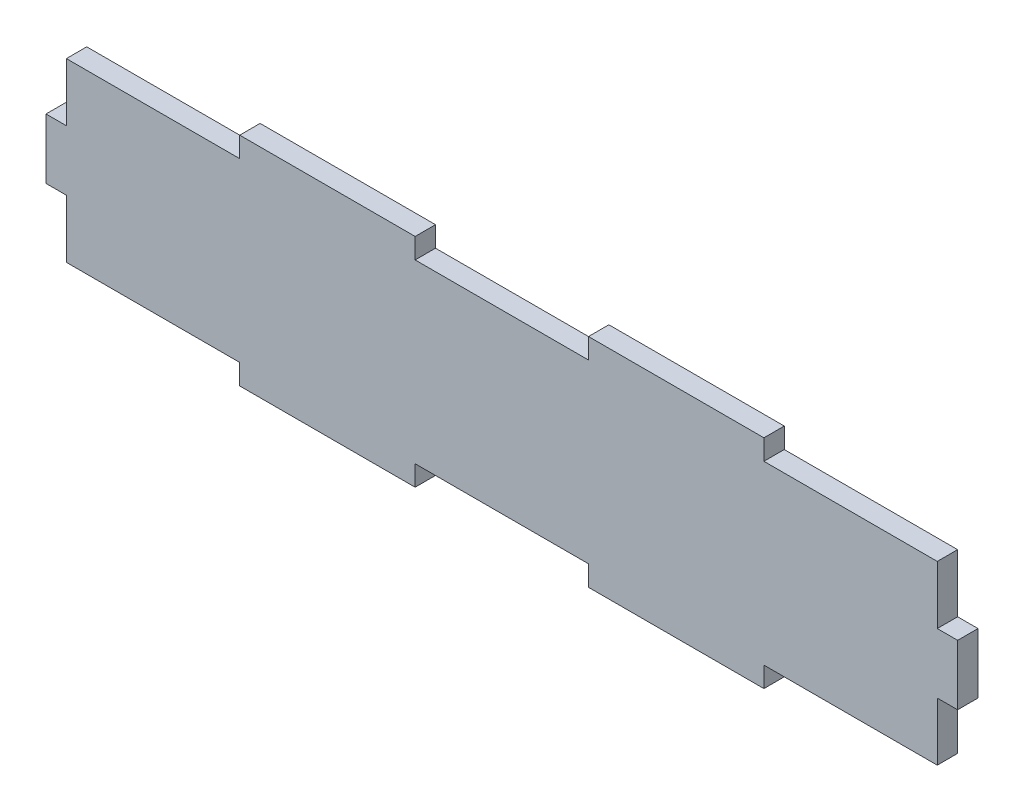
ISO-10303-21;
HEADER;
FILE_DESCRIPTION(('STEP AP214'),'2;1');
FILE_NAME('part.step','',(''),(''),'','','');
FILE_SCHEMA(('AUTOMOTIVE_DESIGN { 1 0 10303 214 1 1 1 1 }'));
ENDSEC;
DATA;
#1=APPLICATION_CONTEXT('core data for automotive mechanical design processes');
#2=APPLICATION_PROTOCOL_DEFINITION('international standard','automotive_design',2000,#1);
#3=PRODUCT_CONTEXT('',#1,'mechanical');
#4=PRODUCT('Part','Part','',(#3));
#5=PRODUCT_RELATED_PRODUCT_CATEGORY('part','',(#4));
#6=PRODUCT_DEFINITION_FORMATION('','',#4);
#7=PRODUCT_DEFINITION_CONTEXT('part definition',#1,'design');
#8=PRODUCT_DEFINITION('design','',#6,#7);
#9=PRODUCT_DEFINITION_SHAPE('','',#8);
#10=(LENGTH_UNIT() NAMED_UNIT(*) SI_UNIT(.MILLI.,.METRE.));
#11=(NAMED_UNIT(*) PLANE_ANGLE_UNIT() SI_UNIT($,.RADIAN.));
#12=(NAMED_UNIT(*) SI_UNIT($,.STERADIAN.) SOLID_ANGLE_UNIT());
#13=UNCERTAINTY_MEASURE_WITH_UNIT(LENGTH_MEASURE(1.E-05),#10,'distance_accuracy_value','');
#14=(GEOMETRIC_REPRESENTATION_CONTEXT(3) GLOBAL_UNCERTAINTY_ASSIGNED_CONTEXT((#13)) GLOBAL_UNIT_ASSIGNED_CONTEXT((#10,
#11,#12)) REPRESENTATION_CONTEXT('',''));
#15=CARTESIAN_POINT('',(0.,0.,0.));
#16=DIRECTION('',(0.,0.,1.));
#17=DIRECTION('',(1.,0.,0.));
#18=AXIS2_PLACEMENT_3D('',#15,#16,#17);
#19=CARTESIAN_POINT('',(-64.15,-4.43333333333333,3.));
#20=DIRECTION('',(1.,0.,0.));
#21=DIRECTION('',(0.,0.,-1.));
#22=AXIS2_PLACEMENT_3D('',#19,#20,#21);
#23=PLANE('',#22);
#24=DIRECTION('',(0.,-1.,0.));
#25=VECTOR('',#24,1.);
#26=CARTESIAN_POINT('',(-64.15,-4.43333333333333,0.));
#27=LINE('',#26,#25);
#28=CARTESIAN_POINT('',(-64.15,-4.43333333333333,0.));
#29=VERTEX_POINT('',#28);
#30=CARTESIAN_POINT('',(-64.15,-13.,0.));
#31=VERTEX_POINT('',#30);
#32=EDGE_CURVE('E260',#29,#31,#27,.T.);
#33=ORIENTED_EDGE('',*,*,#32,.T.);
#34=DIRECTION('',(0.,0.,-1.));
#35=VECTOR('',#34,1.);
#36=CARTESIAN_POINT('',(-64.15,-13.,3.));
#37=LINE('',#36,#35);
#38=CARTESIAN_POINT('',(-64.15,-13.,3.));
#39=VERTEX_POINT('',#38);
#40=EDGE_CURVE('E11',#39,#31,#37,.T.);
#41=ORIENTED_EDGE('',*,*,#40,.F.);
#42=DIRECTION('',(0.,-1.,0.));
#43=VECTOR('',#42,1.);
#44=CARTESIAN_POINT('',(-64.15,-4.43333333333333,3.));
#45=LINE('',#44,#43);
#46=CARTESIAN_POINT('',(-64.15,-4.43333333333333,3.));
#47=VERTEX_POINT('',#46);
#48=EDGE_CURVE('E342',#47,#39,#45,.T.);
#49=ORIENTED_EDGE('',*,*,#48,.F.);
#50=DIRECTION('',(0.,0.,-1.));
#51=VECTOR('',#50,1.);
#52=CARTESIAN_POINT('',(-64.15,-4.43333333333333,3.));
#53=LINE('',#52,#51);
#54=EDGE_CURVE('E256',#47,#29,#53,.T.);
#55=ORIENTED_EDGE('',*,*,#54,.T.);
#56=EDGE_LOOP('',(#33,#41,#49,#55));
#57=FACE_BOUND('',#56,.T.);
#58=ADVANCED_FACE('F39',(#57),#23,.F.);
#59=CARTESIAN_POINT('',(-64.15,-13.,3.));
#60=DIRECTION('',(0.,1.,0.));
#61=DIRECTION('',(0.,0.,1.));
#62=AXIS2_PLACEMENT_3D('',#59,#60,#61);
#63=PLANE('',#62);
#64=DIRECTION('',(1.,0.,0.));
#65=VECTOR('',#64,1.);
#66=CARTESIAN_POINT('',(-64.15,-13.,0.));
#67=LINE('',#66,#65);
#68=CARTESIAN_POINT('',(-38.61,-13.,0.));
#69=VERTEX_POINT('',#68);
#70=EDGE_CURVE('E264',#31,#69,#67,.T.);
#71=ORIENTED_EDGE('',*,*,#70,.T.);
#72=DIRECTION('',(0.,0.,-1.));
#73=VECTOR('',#72,1.);
#74=CARTESIAN_POINT('',(-38.61,-13.,3.));
#75=LINE('',#74,#73);
#76=CARTESIAN_POINT('',(-38.61,-13.,3.));
#77=VERTEX_POINT('',#76);
#78=EDGE_CURVE('E48',#77,#69,#75,.T.);
#79=ORIENTED_EDGE('',*,*,#78,.F.);
#80=DIRECTION('',(1.,0.,0.));
#81=VECTOR('',#80,1.);
#82=CARTESIAN_POINT('',(-64.15,-13.,3.));
#83=LINE('',#82,#81);
#84=EDGE_CURVE('E159',#39,#77,#83,.T.);
#85=ORIENTED_EDGE('',*,*,#84,.F.);
#86=ORIENTED_EDGE('',*,*,#40,.T.);
#87=EDGE_LOOP('',(#71,#79,#85,#86));
#88=FACE_BOUND('',#87,.T.);
#89=ADVANCED_FACE('F548',(#88),#63,.F.);
#90=CARTESIAN_POINT('',(-38.61,-13.,3.));
#91=DIRECTION('',(1.,0.,0.));
#92=DIRECTION('',(0.,0.,-1.));
#93=AXIS2_PLACEMENT_3D('',#90,#91,#92);
#94=PLANE('',#93);
#95=DIRECTION('',(0.,-1.,0.));
#96=VECTOR('',#95,1.);
#97=CARTESIAN_POINT('',(-38.61,-13.,0.));
#98=LINE('',#97,#96);
#99=CARTESIAN_POINT('',(-38.61,-16.,0.));
#100=VERTEX_POINT('',#99);
#101=EDGE_CURVE('E267',#69,#100,#98,.T.);
#102=ORIENTED_EDGE('',*,*,#101,.T.);
#103=DIRECTION('',(0.,0.,-1.));
#104=VECTOR('',#103,1.);
#105=CARTESIAN_POINT('',(-38.61,-16.,3.));
#106=LINE('',#105,#104);
#107=CARTESIAN_POINT('',(-38.61,-16.,3.));
#108=VERTEX_POINT('',#107);
#109=EDGE_CURVE('E433',#108,#100,#106,.T.);
#110=ORIENTED_EDGE('',*,*,#109,.F.);
#111=DIRECTION('',(0.,-1.,0.));
#112=VECTOR('',#111,1.);
#113=CARTESIAN_POINT('',(-38.61,-13.,3.));
#114=LINE('',#113,#112);
#115=EDGE_CURVE('E443',#77,#108,#114,.T.);
#116=ORIENTED_EDGE('',*,*,#115,.F.);
#117=ORIENTED_EDGE('',*,*,#78,.T.);
#118=EDGE_LOOP('',(#102,#110,#116,#117));
#119=FACE_BOUND('',#118,.T.);
#120=ADVANCED_FACE('F441',(#119),#94,.F.);
#121=CARTESIAN_POINT('',(-38.61,-16.,3.));
#122=DIRECTION('',(0.,1.,0.));
#123=DIRECTION('',(0.,0.,1.));
#124=AXIS2_PLACEMENT_3D('',#121,#122,#123);
#125=PLANE('',#124);
#126=DIRECTION('',(1.,0.,0.));
#127=VECTOR('',#126,1.);
#128=CARTESIAN_POINT('',(-38.61,-16.,0.));
#129=LINE('',#128,#127);
#130=CARTESIAN_POINT('',(-12.77,-16.,0.));
#131=VERTEX_POINT('',#130);
#132=EDGE_CURVE('E270',#100,#131,#129,.T.);
#133=ORIENTED_EDGE('',*,*,#132,.T.);
#134=DIRECTION('',(0.,0.,-1.));
#135=VECTOR('',#134,1.);
#136=CARTESIAN_POINT('',(-12.77,-16.,3.));
#137=LINE('',#136,#135);
#138=CARTESIAN_POINT('',(-12.77,-16.,3.));
#139=VERTEX_POINT('',#138);
#140=EDGE_CURVE('E429',#139,#131,#137,.T.);
#141=ORIENTED_EDGE('',*,*,#140,.F.);
#142=DIRECTION('',(1.,0.,0.));
#143=VECTOR('',#142,1.);
#144=CARTESIAN_POINT('',(-38.61,-16.,3.));
#145=LINE('',#144,#143);
#146=EDGE_CURVE('E462',#108,#139,#145,.T.);
#147=ORIENTED_EDGE('',*,*,#146,.F.);
#148=ORIENTED_EDGE('',*,*,#109,.T.);
#149=EDGE_LOOP('',(#133,#141,#147,#148));
#150=FACE_BOUND('',#149,.T.);
#151=ADVANCED_FACE('F452',(#150),#125,.F.);
#152=CARTESIAN_POINT('',(-12.77,-16.,3.));
#153=DIRECTION('',(-1.,0.,0.));
#154=DIRECTION('',(0.,-1.,0.));
#155=AXIS2_PLACEMENT_3D('',#152,#153,#154);
#156=PLANE('',#155);
#157=DIRECTION('',(0.,1.,0.));
#158=VECTOR('',#157,1.);
#159=CARTESIAN_POINT('',(-12.77,-16.,0.));
#160=LINE('',#159,#158);
#161=CARTESIAN_POINT('',(-12.77,-13.,0.));
#162=VERTEX_POINT('',#161);
#163=EDGE_CURVE('E273',#131,#162,#160,.T.);
#164=ORIENTED_EDGE('',*,*,#163,.T.);
#165=DIRECTION('',(0.,0.,-1.));
#166=VECTOR('',#165,1.);
#167=CARTESIAN_POINT('',(-12.77,-13.,3.));
#168=LINE('',#167,#166);
#169=CARTESIAN_POINT('',(-12.77,-13.,3.));
#170=VERTEX_POINT('',#169);
#171=EDGE_CURVE('E425',#170,#162,#168,.T.);
#172=ORIENTED_EDGE('',*,*,#171,.F.);
#173=DIRECTION('',(0.,1.,0.));
#174=VECTOR('',#173,1.);
#175=CARTESIAN_POINT('',(-12.77,-16.,3.));
#176=LINE('',#175,#174);
#177=EDGE_CURVE('E458',#139,#170,#176,.T.);
#178=ORIENTED_EDGE('',*,*,#177,.F.);
#179=ORIENTED_EDGE('',*,*,#140,.T.);
#180=EDGE_LOOP('',(#164,#172,#178,#179));
#181=FACE_BOUND('',#180,.T.);
#182=ADVANCED_FACE('F456',(#181),#156,.F.);
#183=CARTESIAN_POINT('',(-12.77,-13.,3.));
#184=DIRECTION('',(0.,1.,0.));
#185=DIRECTION('',(-1.,0.,0.));
#186=AXIS2_PLACEMENT_3D('',#183,#184,#185);
#187=PLANE('',#186);
#188=DIRECTION('',(1.,0.,0.));
#189=VECTOR('',#188,1.);
#190=CARTESIAN_POINT('',(-12.77,-13.,0.));
#191=LINE('',#190,#189);
#192=CARTESIAN_POINT('',(12.77,-13.,0.));
#193=VERTEX_POINT('',#192);
#194=EDGE_CURVE('E276',#162,#193,#191,.T.);
#195=ORIENTED_EDGE('',*,*,#194,.T.);
#196=DIRECTION('',(0.,0.,-1.));
#197=VECTOR('',#196,1.);
#198=CARTESIAN_POINT('',(12.77,-13.,3.));
#199=LINE('',#198,#197);
#200=CARTESIAN_POINT('',(12.77,-13.,3.));
#201=VERTEX_POINT('',#200);
#202=EDGE_CURVE('E421',#201,#193,#199,.T.);
#203=ORIENTED_EDGE('',*,*,#202,.F.);
#204=DIRECTION('',(1.,0.,0.));
#205=VECTOR('',#204,1.);
#206=CARTESIAN_POINT('',(-12.77,-13.,3.));
#207=LINE('',#206,#205);
#208=EDGE_CURVE('E461',#170,#201,#207,.T.);
#209=ORIENTED_EDGE('',*,*,#208,.F.);
#210=ORIENTED_EDGE('',*,*,#171,.T.);
#211=EDGE_LOOP('',(#195,#203,#209,#210));
#212=FACE_BOUND('',#211,.T.);
#213=ADVANCED_FACE('F561',(#212),#187,.F.);
#214=CARTESIAN_POINT('',(12.77,-13.,3.));
#215=DIRECTION('',(1.,0.,0.));
#216=DIRECTION('',(0.,1.,0.));
#217=AXIS2_PLACEMENT_3D('',#214,#215,#216);
#218=PLANE('',#217);
#219=DIRECTION('',(0.,-1.,0.));
#220=VECTOR('',#219,1.);
#221=CARTESIAN_POINT('',(12.77,-13.,0.));
#222=LINE('',#221,#220);
#223=CARTESIAN_POINT('',(12.77,-16.,0.));
#224=VERTEX_POINT('',#223);
#225=EDGE_CURVE('E279',#193,#224,#222,.T.);
#226=ORIENTED_EDGE('',*,*,#225,.T.);
#227=DIRECTION('',(0.,0.,-1.));
#228=VECTOR('',#227,1.);
#229=CARTESIAN_POINT('',(12.77,-16.,3.));
#230=LINE('',#229,#228);
#231=CARTESIAN_POINT('',(12.77,-16.,3.));
#232=VERTEX_POINT('',#231);
#233=EDGE_CURVE('E417',#232,#224,#230,.T.);
#234=ORIENTED_EDGE('',*,*,#233,.F.);
#235=DIRECTION('',(0.,-1.,0.));
#236=VECTOR('',#235,1.);
#237=CARTESIAN_POINT('',(12.77,-13.,3.));
#238=LINE('',#237,#236);
#239=EDGE_CURVE('E466',#201,#232,#238,.T.);
#240=ORIENTED_EDGE('',*,*,#239,.F.);
#241=ORIENTED_EDGE('',*,*,#202,.T.);
#242=EDGE_LOOP('',(#226,#234,#240,#241));
#243=FACE_BOUND('',#242,.T.);
#244=ADVANCED_FACE('F564',(#243),#218,.F.);
#245=CARTESIAN_POINT('',(12.77,-16.,3.));
#246=DIRECTION('',(0.,1.,0.));
#247=DIRECTION('',(0.,0.,1.));
#248=AXIS2_PLACEMENT_3D('',#245,#246,#247);
#249=PLANE('',#248);
#250=DIRECTION('',(1.,0.,0.));
#251=VECTOR('',#250,1.);
#252=CARTESIAN_POINT('',(12.77,-16.,0.));
#253=LINE('',#252,#251);
#254=CARTESIAN_POINT('',(38.61,-16.,0.));
#255=VERTEX_POINT('',#254);
#256=EDGE_CURVE('E282',#224,#255,#253,.T.);
#257=ORIENTED_EDGE('',*,*,#256,.T.);
#258=DIRECTION('',(0.,0.,-1.));
#259=VECTOR('',#258,1.);
#260=CARTESIAN_POINT('',(38.61,-16.,3.));
#261=LINE('',#260,#259);
#262=CARTESIAN_POINT('',(38.61,-16.,3.));
#263=VERTEX_POINT('',#262);
#264=EDGE_CURVE('E413',#263,#255,#261,.T.);
#265=ORIENTED_EDGE('',*,*,#264,.F.);
#266=DIRECTION('',(1.,0.,0.));
#267=VECTOR('',#266,1.);
#268=CARTESIAN_POINT('',(12.77,-16.,3.));
#269=LINE('',#268,#267);
#270=EDGE_CURVE('E473',#232,#263,#269,.T.);
#271=ORIENTED_EDGE('',*,*,#270,.F.);
#272=ORIENTED_EDGE('',*,*,#233,.T.);
#273=EDGE_LOOP('',(#257,#265,#271,#272));
#274=FACE_BOUND('',#273,.T.);
#275=ADVANCED_FACE('F568',(#274),#249,.F.);
#276=CARTESIAN_POINT('',(38.61,-16.,3.));
#277=DIRECTION('',(-1.,0.,0.));
#278=DIRECTION('',(0.,0.,1.));
#279=AXIS2_PLACEMENT_3D('',#276,#277,#278);
#280=PLANE('',#279);
#281=DIRECTION('',(0.,1.,0.));
#282=VECTOR('',#281,1.);
#283=CARTESIAN_POINT('',(38.61,-16.,0.));
#284=LINE('',#283,#282);
#285=CARTESIAN_POINT('',(38.61,-13.,0.));
#286=VERTEX_POINT('',#285);
#287=EDGE_CURVE('E285',#255,#286,#284,.T.);
#288=ORIENTED_EDGE('',*,*,#287,.T.);
#289=DIRECTION('',(0.,0.,-1.));
#290=VECTOR('',#289,1.);
#291=CARTESIAN_POINT('',(38.61,-13.,3.));
#292=LINE('',#291,#290);
#293=CARTESIAN_POINT('',(38.61,-13.,3.));
#294=VERTEX_POINT('',#293);
#295=EDGE_CURVE('E409',#294,#286,#292,.T.);
#296=ORIENTED_EDGE('',*,*,#295,.F.);
#297=DIRECTION('',(0.,1.,0.));
#298=VECTOR('',#297,1.);
#299=CARTESIAN_POINT('',(38.61,-16.,3.));
#300=LINE('',#299,#298);
#301=EDGE_CURVE('E476',#263,#294,#300,.T.);
#302=ORIENTED_EDGE('',*,*,#301,.F.);
#303=ORIENTED_EDGE('',*,*,#264,.T.);
#304=EDGE_LOOP('',(#288,#296,#302,#303));
#305=FACE_BOUND('',#304,.T.);
#306=ADVANCED_FACE('F572',(#305),#280,.F.);
#307=CARTESIAN_POINT('',(38.61,-13.,3.));
#308=DIRECTION('',(0.,1.,0.));
#309=DIRECTION('',(-1.,0.,0.));
#310=AXIS2_PLACEMENT_3D('',#307,#308,#309);
#311=PLANE('',#310);
#312=DIRECTION('',(1.,0.,0.));
#313=VECTOR('',#312,1.);
#314=CARTESIAN_POINT('',(38.61,-13.,0.));
#315=LINE('',#314,#313);
#316=CARTESIAN_POINT('',(64.15,-13.,0.));
#317=VERTEX_POINT('',#316);
#318=EDGE_CURVE('E288',#286,#317,#315,.T.);
#319=ORIENTED_EDGE('',*,*,#318,.T.);
#320=DIRECTION('',(0.,0.,-1.));
#321=VECTOR('',#320,1.);
#322=CARTESIAN_POINT('',(64.15,-13.,3.));
#323=LINE('',#322,#321);
#324=CARTESIAN_POINT('',(64.15,-13.,3.));
#325=VERTEX_POINT('',#324);
#326=EDGE_CURVE('E405',#325,#317,#323,.T.);
#327=ORIENTED_EDGE('',*,*,#326,.F.);
#328=DIRECTION('',(1.,0.,0.));
#329=VECTOR('',#328,1.);
#330=CARTESIAN_POINT('',(38.61,-13.,3.));
#331=LINE('',#330,#329);
#332=EDGE_CURVE('E479',#294,#325,#331,.T.);
#333=ORIENTED_EDGE('',*,*,#332,.F.);
#334=ORIENTED_EDGE('',*,*,#295,.T.);
#335=EDGE_LOOP('',(#319,#327,#333,#334));
#336=FACE_BOUND('',#335,.T.);
#337=ADVANCED_FACE('F576',(#336),#311,.F.);
#338=CARTESIAN_POINT('',(64.15,-13.,3.));
#339=DIRECTION('',(-1.,0.,0.));
#340=DIRECTION('',(0.,0.,1.));
#341=AXIS2_PLACEMENT_3D('',#338,#339,#340);
#342=PLANE('',#341);
#343=DIRECTION('',(0.,1.,0.));
#344=VECTOR('',#343,1.);
#345=CARTESIAN_POINT('',(64.15,-13.,0.));
#346=LINE('',#345,#344);
#347=CARTESIAN_POINT('',(64.15,-4.43333333333334,0.));
#348=VERTEX_POINT('',#347);
#349=EDGE_CURVE('E291',#317,#348,#346,.T.);
#350=ORIENTED_EDGE('',*,*,#349,.T.);
#351=DIRECTION('',(0.,0.,-1.));
#352=VECTOR('',#351,1.);
#353=CARTESIAN_POINT('',(64.15,-4.43333333333334,3.));
#354=LINE('',#353,#352);
#355=CARTESIAN_POINT('',(64.15,-4.43333333333334,3.));
#356=VERTEX_POINT('',#355);
#357=EDGE_CURVE('E401',#356,#348,#354,.T.);
#358=ORIENTED_EDGE('',*,*,#357,.F.);
#359=DIRECTION('',(0.,1.,0.));
#360=VECTOR('',#359,1.);
#361=CARTESIAN_POINT('',(64.15,-13.,3.));
#362=LINE('',#361,#360);
#363=EDGE_CURVE('E482',#325,#356,#362,.T.);
#364=ORIENTED_EDGE('',*,*,#363,.F.);
#365=ORIENTED_EDGE('',*,*,#326,.T.);
#366=EDGE_LOOP('',(#350,#358,#364,#365));
#367=FACE_BOUND('',#366,.T.);
#368=ADVANCED_FACE('F580',(#367),#342,.F.);
#369=CARTESIAN_POINT('',(67.15,-4.43333333333334,3.));
#370=DIRECTION('',(0.,1.,0.));
#371=DIRECTION('',(0.,0.,1.));
#372=AXIS2_PLACEMENT_3D('',#369,#370,#371);
#373=PLANE('',#372);
#374=DIRECTION('',(1.,0.,0.));
#375=VECTOR('',#374,1.);
#376=CARTESIAN_POINT('',(67.15,-4.43333333333334,0.));
#377=LINE('',#376,#375);
#378=CARTESIAN_POINT('',(67.15,-4.43333333333334,0.));
#379=VERTEX_POINT('',#378);
#380=EDGE_CURVE('E294',#348,#379,#377,.T.);
#381=ORIENTED_EDGE('',*,*,#380,.T.);
#382=DIRECTION('',(0.,0.,-1.));
#383=VECTOR('',#382,1.);
#384=CARTESIAN_POINT('',(67.15,-4.43333333333334,3.));
#385=LINE('',#384,#383);
#386=CARTESIAN_POINT('',(67.15,-4.43333333333334,3.));
#387=VERTEX_POINT('',#386);
#388=EDGE_CURVE('E397',#387,#379,#385,.T.);
#389=ORIENTED_EDGE('',*,*,#388,.F.);
#390=DIRECTION('',(1.,0.,0.));
#391=VECTOR('',#390,1.);
#392=CARTESIAN_POINT('',(67.15,-4.43333333333334,3.));
#393=LINE('',#392,#391);
#394=EDGE_CURVE('E485',#356,#387,#393,.T.);
#395=ORIENTED_EDGE('',*,*,#394,.F.);
#396=ORIENTED_EDGE('',*,*,#357,.T.);
#397=EDGE_LOOP('',(#381,#389,#395,#396));
#398=FACE_BOUND('',#397,.T.);
#399=ADVANCED_FACE('F584',(#398),#373,.F.);
#400=CARTESIAN_POINT('',(67.15,4.43333333333333,3.));
#401=DIRECTION('',(-1.,0.,0.));
#402=DIRECTION('',(0.,0.,1.));
#403=AXIS2_PLACEMENT_3D('',#400,#401,#402);
#404=PLANE('',#403);
#405=DIRECTION('',(0.,1.,0.));
#406=VECTOR('',#405,1.);
#407=CARTESIAN_POINT('',(67.15,4.43333333333333,0.));
#408=LINE('',#407,#406);
#409=CARTESIAN_POINT('',(67.15,4.43333333333333,0.));
#410=VERTEX_POINT('',#409);
#411=EDGE_CURVE('E297',#379,#410,#408,.T.);
#412=ORIENTED_EDGE('',*,*,#411,.T.);
#413=DIRECTION('',(0.,0.,-1.));
#414=VECTOR('',#413,1.);
#415=CARTESIAN_POINT('',(67.15,4.43333333333333,3.));
#416=LINE('',#415,#414);
#417=CARTESIAN_POINT('',(67.15,4.43333333333333,3.));
#418=VERTEX_POINT('',#417);
#419=EDGE_CURVE('E393',#418,#410,#416,.T.);
#420=ORIENTED_EDGE('',*,*,#419,.F.);
#421=DIRECTION('',(0.,1.,0.));
#422=VECTOR('',#421,1.);
#423=CARTESIAN_POINT('',(67.15,4.43333333333333,3.));
#424=LINE('',#423,#422);
#425=EDGE_CURVE('E488',#387,#418,#424,.T.);
#426=ORIENTED_EDGE('',*,*,#425,.F.);
#427=ORIENTED_EDGE('',*,*,#388,.T.);
#428=EDGE_LOOP('',(#412,#420,#426,#427));
#429=FACE_BOUND('',#428,.T.);
#430=ADVANCED_FACE('F588',(#429),#404,.F.);
#431=CARTESIAN_POINT('',(64.15,4.43333333333333,3.));
#432=DIRECTION('',(0.,-1.,0.));
#433=DIRECTION('',(0.,0.,-1.));
#434=AXIS2_PLACEMENT_3D('',#431,#432,#433);
#435=PLANE('',#434);
#436=DIRECTION('',(-1.,0.,0.));
#437=VECTOR('',#436,1.);
#438=CARTESIAN_POINT('',(64.15,4.43333333333333,0.));
#439=LINE('',#438,#437);
#440=CARTESIAN_POINT('',(64.15,4.43333333333333,0.));
#441=VERTEX_POINT('',#440);
#442=EDGE_CURVE('E300',#410,#441,#439,.T.);
#443=ORIENTED_EDGE('',*,*,#442,.T.);
#444=DIRECTION('',(0.,0.,-1.));
#445=VECTOR('',#444,1.);
#446=CARTESIAN_POINT('',(64.15,4.43333333333333,3.));
#447=LINE('',#446,#445);
#448=CARTESIAN_POINT('',(64.15,4.43333333333333,3.));
#449=VERTEX_POINT('',#448);
#450=EDGE_CURVE('E389',#449,#441,#447,.T.);
#451=ORIENTED_EDGE('',*,*,#450,.F.);
#452=DIRECTION('',(-1.,0.,0.));
#453=VECTOR('',#452,1.);
#454=CARTESIAN_POINT('',(64.15,4.43333333333333,3.));
#455=LINE('',#454,#453);
#456=EDGE_CURVE('E491',#418,#449,#455,.T.);
#457=ORIENTED_EDGE('',*,*,#456,.F.);
#458=ORIENTED_EDGE('',*,*,#419,.T.);
#459=EDGE_LOOP('',(#443,#451,#457,#458));
#460=FACE_BOUND('',#459,.T.);
#461=ADVANCED_FACE('F592',(#460),#435,.F.);
#462=CARTESIAN_POINT('',(64.15,13.,3.));
#463=DIRECTION('',(-1.,0.,0.));
#464=DIRECTION('',(0.,0.,1.));
#465=AXIS2_PLACEMENT_3D('',#462,#463,#464);
#466=PLANE('',#465);
#467=DIRECTION('',(0.,1.,0.));
#468=VECTOR('',#467,1.);
#469=CARTESIAN_POINT('',(64.15,13.,0.));
#470=LINE('',#469,#468);
#471=CARTESIAN_POINT('',(64.15,13.,0.));
#472=VERTEX_POINT('',#471);
#473=EDGE_CURVE('E303',#441,#472,#470,.T.);
#474=ORIENTED_EDGE('',*,*,#473,.T.);
#475=DIRECTION('',(0.,0.,-1.));
#476=VECTOR('',#475,1.);
#477=CARTESIAN_POINT('',(64.15,13.,3.));
#478=LINE('',#477,#476);
#479=CARTESIAN_POINT('',(64.15,13.,3.));
#480=VERTEX_POINT('',#479);
#481=EDGE_CURVE('E385',#480,#472,#478,.T.);
#482=ORIENTED_EDGE('',*,*,#481,.F.);
#483=DIRECTION('',(0.,1.,0.));
#484=VECTOR('',#483,1.);
#485=CARTESIAN_POINT('',(64.15,13.,3.));
#486=LINE('',#485,#484);
#487=EDGE_CURVE('E494',#449,#480,#486,.T.);
#488=ORIENTED_EDGE('',*,*,#487,.F.);
#489=ORIENTED_EDGE('',*,*,#450,.T.);
#490=EDGE_LOOP('',(#474,#482,#488,#489));
#491=FACE_BOUND('',#490,.T.);
#492=ADVANCED_FACE('F596',(#491),#466,.F.);
#493=CARTESIAN_POINT('',(38.61,13.,3.));
#494=DIRECTION('',(0.,-1.,0.));
#495=DIRECTION('',(1.,0.,0.));
#496=AXIS2_PLACEMENT_3D('',#493,#494,#495);
#497=PLANE('',#496);
#498=DIRECTION('',(-1.,0.,0.));
#499=VECTOR('',#498,1.);
#500=CARTESIAN_POINT('',(38.61,13.,0.));
#501=LINE('',#500,#499);
#502=CARTESIAN_POINT('',(38.61,13.,0.));
#503=VERTEX_POINT('',#502);
#504=EDGE_CURVE('E306',#472,#503,#501,.T.);
#505=ORIENTED_EDGE('',*,*,#504,.T.);
#506=DIRECTION('',(0.,0.,-1.));
#507=VECTOR('',#506,1.);
#508=CARTESIAN_POINT('',(38.61,13.,3.));
#509=LINE('',#508,#507);
#510=CARTESIAN_POINT('',(38.61,13.,3.));
#511=VERTEX_POINT('',#510);
#512=EDGE_CURVE('E381',#511,#503,#509,.T.);
#513=ORIENTED_EDGE('',*,*,#512,.F.);
#514=DIRECTION('',(-1.,0.,0.));
#515=VECTOR('',#514,1.);
#516=CARTESIAN_POINT('',(38.61,13.,3.));
#517=LINE('',#516,#515);
#518=EDGE_CURVE('E497',#480,#511,#517,.T.);
#519=ORIENTED_EDGE('',*,*,#518,.F.);
#520=ORIENTED_EDGE('',*,*,#481,.T.);
#521=EDGE_LOOP('',(#505,#513,#519,#520));
#522=FACE_BOUND('',#521,.T.);
#523=ADVANCED_FACE('F600',(#522),#497,.F.);
#524=CARTESIAN_POINT('',(38.61,16.,3.));
#525=DIRECTION('',(-1.,0.,0.));
#526=DIRECTION('',(0.,0.,1.));
#527=AXIS2_PLACEMENT_3D('',#524,#525,#526);
#528=PLANE('',#527);
#529=DIRECTION('',(0.,1.,0.));
#530=VECTOR('',#529,1.);
#531=CARTESIAN_POINT('',(38.61,16.,0.));
#532=LINE('',#531,#530);
#533=CARTESIAN_POINT('',(38.61,16.,0.));
#534=VERTEX_POINT('',#533);
#535=EDGE_CURVE('E309',#503,#534,#532,.T.);
#536=ORIENTED_EDGE('',*,*,#535,.T.);
#537=DIRECTION('',(0.,0.,-1.));
#538=VECTOR('',#537,1.);
#539=CARTESIAN_POINT('',(38.61,16.,3.));
#540=LINE('',#539,#538);
#541=CARTESIAN_POINT('',(38.61,16.,3.));
#542=VERTEX_POINT('',#541);
#543=EDGE_CURVE('E377',#542,#534,#540,.T.);
#544=ORIENTED_EDGE('',*,*,#543,.F.);
#545=DIRECTION('',(0.,1.,0.));
#546=VECTOR('',#545,1.);
#547=CARTESIAN_POINT('',(38.61,16.,3.));
#548=LINE('',#547,#546);
#549=EDGE_CURVE('E500',#511,#542,#548,.T.);
#550=ORIENTED_EDGE('',*,*,#549,.F.);
#551=ORIENTED_EDGE('',*,*,#512,.T.);
#552=EDGE_LOOP('',(#536,#544,#550,#551));
#553=FACE_BOUND('',#552,.T.);
#554=ADVANCED_FACE('F604',(#553),#528,.F.);
#555=CARTESIAN_POINT('',(12.77,16.,3.));
#556=DIRECTION('',(0.,-1.,0.));
#557=DIRECTION('',(0.,0.,-1.));
#558=AXIS2_PLACEMENT_3D('',#555,#556,#557);
#559=PLANE('',#558);
#560=DIRECTION('',(-1.,0.,0.));
#561=VECTOR('',#560,1.);
#562=CARTESIAN_POINT('',(12.77,16.,0.));
#563=LINE('',#562,#561);
#564=CARTESIAN_POINT('',(12.77,16.,0.));
#565=VERTEX_POINT('',#564);
#566=EDGE_CURVE('E312',#534,#565,#563,.T.);
#567=ORIENTED_EDGE('',*,*,#566,.T.);
#568=DIRECTION('',(0.,0.,-1.));
#569=VECTOR('',#568,1.);
#570=CARTESIAN_POINT('',(12.77,16.,3.));
#571=LINE('',#570,#569);
#572=CARTESIAN_POINT('',(12.77,16.,3.));
#573=VERTEX_POINT('',#572);
#574=EDGE_CURVE('E373',#573,#565,#571,.T.);
#575=ORIENTED_EDGE('',*,*,#574,.F.);
#576=DIRECTION('',(-1.,0.,0.));
#577=VECTOR('',#576,1.);
#578=CARTESIAN_POINT('',(12.77,16.,3.));
#579=LINE('',#578,#577);
#580=EDGE_CURVE('E503',#542,#573,#579,.T.);
#581=ORIENTED_EDGE('',*,*,#580,.F.);
#582=ORIENTED_EDGE('',*,*,#543,.T.);
#583=EDGE_LOOP('',(#567,#575,#581,#582));
#584=FACE_BOUND('',#583,.T.);
#585=ADVANCED_FACE('F608',(#584),#559,.F.);
#586=CARTESIAN_POINT('',(12.77,13.,3.));
#587=DIRECTION('',(1.,0.,0.));
#588=DIRECTION('',(0.,1.,0.));
#589=AXIS2_PLACEMENT_3D('',#586,#587,#588);
#590=PLANE('',#589);
#591=DIRECTION('',(0.,-1.,0.));
#592=VECTOR('',#591,1.);
#593=CARTESIAN_POINT('',(12.77,13.,0.));
#594=LINE('',#593,#592);
#595=CARTESIAN_POINT('',(12.77,13.,0.));
#596=VERTEX_POINT('',#595);
#597=EDGE_CURVE('E315',#565,#596,#594,.T.);
#598=ORIENTED_EDGE('',*,*,#597,.T.);
#599=DIRECTION('',(0.,0.,-1.));
#600=VECTOR('',#599,1.);
#601=CARTESIAN_POINT('',(12.77,13.,3.));
#602=LINE('',#601,#600);
#603=CARTESIAN_POINT('',(12.77,13.,3.));
#604=VERTEX_POINT('',#603);
#605=EDGE_CURVE('E369',#604,#596,#602,.T.);
#606=ORIENTED_EDGE('',*,*,#605,.F.);
#607=DIRECTION('',(0.,-1.,0.));
#608=VECTOR('',#607,1.);
#609=CARTESIAN_POINT('',(12.77,13.,3.));
#610=LINE('',#609,#608);
#611=EDGE_CURVE('E506',#573,#604,#610,.T.);
#612=ORIENTED_EDGE('',*,*,#611,.F.);
#613=ORIENTED_EDGE('',*,*,#574,.T.);
#614=EDGE_LOOP('',(#598,#606,#612,#613));
#615=FACE_BOUND('',#614,.T.);
#616=ADVANCED_FACE('F612',(#615),#590,.F.);
#617=CARTESIAN_POINT('',(-12.77,13.,3.));
#618=DIRECTION('',(0.,-1.,0.));
#619=DIRECTION('',(1.,0.,0.));
#620=AXIS2_PLACEMENT_3D('',#617,#618,#619);
#621=PLANE('',#620);
#622=DIRECTION('',(-1.,0.,0.));
#623=VECTOR('',#622,1.);
#624=CARTESIAN_POINT('',(-12.77,13.,0.));
#625=LINE('',#624,#623);
#626=CARTESIAN_POINT('',(-12.77,13.,0.));
#627=VERTEX_POINT('',#626);
#628=EDGE_CURVE('E318',#596,#627,#625,.T.);
#629=ORIENTED_EDGE('',*,*,#628,.T.);
#630=DIRECTION('',(0.,0.,-1.));
#631=VECTOR('',#630,1.);
#632=CARTESIAN_POINT('',(-12.77,13.,3.));
#633=LINE('',#632,#631);
#634=CARTESIAN_POINT('',(-12.77,13.,3.));
#635=VERTEX_POINT('',#634);
#636=EDGE_CURVE('E365',#635,#627,#633,.T.);
#637=ORIENTED_EDGE('',*,*,#636,.F.);
#638=DIRECTION('',(-1.,0.,0.));
#639=VECTOR('',#638,1.);
#640=CARTESIAN_POINT('',(-12.77,13.,3.));
#641=LINE('',#640,#639);
#642=EDGE_CURVE('E509',#604,#635,#641,.T.);
#643=ORIENTED_EDGE('',*,*,#642,.F.);
#644=ORIENTED_EDGE('',*,*,#605,.T.);
#645=EDGE_LOOP('',(#629,#637,#643,#644));
#646=FACE_BOUND('',#645,.T.);
#647=ADVANCED_FACE('F616',(#646),#621,.F.);
#648=CARTESIAN_POINT('',(-12.77,16.,3.));
#649=DIRECTION('',(-1.,0.,0.));
#650=DIRECTION('',(0.,-1.,0.));
#651=AXIS2_PLACEMENT_3D('',#648,#649,#650);
#652=PLANE('',#651);
#653=DIRECTION('',(0.,1.,0.));
#654=VECTOR('',#653,1.);
#655=CARTESIAN_POINT('',(-12.77,16.,0.));
#656=LINE('',#655,#654);
#657=CARTESIAN_POINT('',(-12.77,16.,0.));
#658=VERTEX_POINT('',#657);
#659=EDGE_CURVE('E321',#627,#658,#656,.T.);
#660=ORIENTED_EDGE('',*,*,#659,.T.);
#661=DIRECTION('',(0.,0.,-1.));
#662=VECTOR('',#661,1.);
#663=CARTESIAN_POINT('',(-12.77,16.,3.));
#664=LINE('',#663,#662);
#665=CARTESIAN_POINT('',(-12.77,16.,3.));
#666=VERTEX_POINT('',#665);
#667=EDGE_CURVE('E361',#666,#658,#664,.T.);
#668=ORIENTED_EDGE('',*,*,#667,.F.);
#669=DIRECTION('',(0.,1.,0.));
#670=VECTOR('',#669,1.);
#671=CARTESIAN_POINT('',(-12.77,16.,3.));
#672=LINE('',#671,#670);
#673=EDGE_CURVE('E512',#635,#666,#672,.T.);
#674=ORIENTED_EDGE('',*,*,#673,.F.);
#675=ORIENTED_EDGE('',*,*,#636,.T.);
#676=EDGE_LOOP('',(#660,#668,#674,#675));
#677=FACE_BOUND('',#676,.T.);
#678=ADVANCED_FACE('F620',(#677),#652,.F.);
#679=CARTESIAN_POINT('',(-38.61,16.,3.));
#680=DIRECTION('',(0.,-1.,0.));
#681=DIRECTION('',(0.,0.,-1.));
#682=AXIS2_PLACEMENT_3D('',#679,#680,#681);
#683=PLANE('',#682);
#684=DIRECTION('',(-1.,0.,0.));
#685=VECTOR('',#684,1.);
#686=CARTESIAN_POINT('',(-38.61,16.,0.));
#687=LINE('',#686,#685);
#688=CARTESIAN_POINT('',(-38.61,16.,0.));
#689=VERTEX_POINT('',#688);
#690=EDGE_CURVE('E324',#658,#689,#687,.T.);
#691=ORIENTED_EDGE('',*,*,#690,.T.);
#692=DIRECTION('',(0.,0.,-1.));
#693=VECTOR('',#692,1.);
#694=CARTESIAN_POINT('',(-38.61,16.,3.));
#695=LINE('',#694,#693);
#696=CARTESIAN_POINT('',(-38.61,16.,3.));
#697=VERTEX_POINT('',#696);
#698=EDGE_CURVE('E357',#697,#689,#695,.T.);
#699=ORIENTED_EDGE('',*,*,#698,.F.);
#700=DIRECTION('',(-1.,0.,0.));
#701=VECTOR('',#700,1.);
#702=CARTESIAN_POINT('',(-38.61,16.,3.));
#703=LINE('',#702,#701);
#704=EDGE_CURVE('E515',#666,#697,#703,.T.);
#705=ORIENTED_EDGE('',*,*,#704,.F.);
#706=ORIENTED_EDGE('',*,*,#667,.T.);
#707=EDGE_LOOP('',(#691,#699,#705,#706));
#708=FACE_BOUND('',#707,.T.);
#709=ADVANCED_FACE('F624',(#708),#683,.F.);
#710=CARTESIAN_POINT('',(-38.61,13.,3.));
#711=DIRECTION('',(1.,0.,0.));
#712=DIRECTION('',(0.,0.,-1.));
#713=AXIS2_PLACEMENT_3D('',#710,#711,#712);
#714=PLANE('',#713);
#715=DIRECTION('',(0.,-1.,0.));
#716=VECTOR('',#715,1.);
#717=CARTESIAN_POINT('',(-38.61,13.,0.));
#718=LINE('',#717,#716);
#719=CARTESIAN_POINT('',(-38.61,13.,0.));
#720=VERTEX_POINT('',#719);
#721=EDGE_CURVE('E327',#689,#720,#718,.T.);
#722=ORIENTED_EDGE('',*,*,#721,.T.);
#723=DIRECTION('',(0.,0.,-1.));
#724=VECTOR('',#723,1.);
#725=CARTESIAN_POINT('',(-38.61,13.,3.));
#726=LINE('',#725,#724);
#727=CARTESIAN_POINT('',(-38.61,13.,3.));
#728=VERTEX_POINT('',#727);
#729=EDGE_CURVE('E353',#728,#720,#726,.T.);
#730=ORIENTED_EDGE('',*,*,#729,.F.);
#731=DIRECTION('',(0.,-1.,0.));
#732=VECTOR('',#731,1.);
#733=CARTESIAN_POINT('',(-38.61,13.,3.));
#734=LINE('',#733,#732);
#735=EDGE_CURVE('E518',#697,#728,#734,.T.);
#736=ORIENTED_EDGE('',*,*,#735,.F.);
#737=ORIENTED_EDGE('',*,*,#698,.T.);
#738=EDGE_LOOP('',(#722,#730,#736,#737));
#739=FACE_BOUND('',#738,.T.);
#740=ADVANCED_FACE('F628',(#739),#714,.F.);
#741=CARTESIAN_POINT('',(-64.15,13.,3.));
#742=DIRECTION('',(0.,-1.,0.));
#743=DIRECTION('',(0.,0.,-1.));
#744=AXIS2_PLACEMENT_3D('',#741,#742,#743);
#745=PLANE('',#744);
#746=DIRECTION('',(-1.,0.,0.));
#747=VECTOR('',#746,1.);
#748=CARTESIAN_POINT('',(-64.15,13.,0.));
#749=LINE('',#748,#747);
#750=CARTESIAN_POINT('',(-64.15,13.,0.));
#751=VERTEX_POINT('',#750);
#752=EDGE_CURVE('E330',#720,#751,#749,.T.);
#753=ORIENTED_EDGE('',*,*,#752,.T.);
#754=DIRECTION('',(0.,0.,-1.));
#755=VECTOR('',#754,1.);
#756=CARTESIAN_POINT('',(-64.15,13.,3.));
#757=LINE('',#756,#755);
#758=CARTESIAN_POINT('',(-64.15,13.,3.));
#759=VERTEX_POINT('',#758);
#760=EDGE_CURVE('E349',#759,#751,#757,.T.);
#761=ORIENTED_EDGE('',*,*,#760,.F.);
#762=DIRECTION('',(-1.,0.,0.));
#763=VECTOR('',#762,1.);
#764=CARTESIAN_POINT('',(-64.15,13.,3.));
#765=LINE('',#764,#763);
#766=EDGE_CURVE('E521',#728,#759,#765,.T.);
#767=ORIENTED_EDGE('',*,*,#766,.F.);
#768=ORIENTED_EDGE('',*,*,#729,.T.);
#769=EDGE_LOOP('',(#753,#761,#767,#768));
#770=FACE_BOUND('',#769,.T.);
#771=ADVANCED_FACE('F529',(#770),#745,.F.);
#772=CARTESIAN_POINT('',(-64.15,4.43333333333334,3.));
#773=DIRECTION('',(1.,0.,0.));
#774=DIRECTION('',(0.,0.,-1.));
#775=AXIS2_PLACEMENT_3D('',#772,#773,#774);
#776=PLANE('',#775);
#777=DIRECTION('',(0.,-1.,0.));
#778=VECTOR('',#777,1.);
#779=CARTESIAN_POINT('',(-64.15,4.43333333333334,0.));
#780=LINE('',#779,#778);
#781=CARTESIAN_POINT('',(-64.15,4.43333333333334,0.));
#782=VERTEX_POINT('',#781);
#783=EDGE_CURVE('E333',#751,#782,#780,.T.);
#784=ORIENTED_EDGE('',*,*,#783,.T.);
#785=DIRECTION('',(0.,0.,-1.));
#786=VECTOR('',#785,1.);
#787=CARTESIAN_POINT('',(-64.15,4.43333333333334,3.));
#788=LINE('',#787,#786);
#789=CARTESIAN_POINT('',(-64.15,4.43333333333334,3.));
#790=VERTEX_POINT('',#789);
#791=EDGE_CURVE('E249',#790,#782,#788,.T.);
#792=ORIENTED_EDGE('',*,*,#791,.F.);
#793=DIRECTION('',(0.,-1.,0.));
#794=VECTOR('',#793,1.);
#795=CARTESIAN_POINT('',(-64.15,4.43333333333334,3.));
#796=LINE('',#795,#794);
#797=EDGE_CURVE('E238',#759,#790,#796,.T.);
#798=ORIENTED_EDGE('',*,*,#797,.F.);
#799=ORIENTED_EDGE('',*,*,#760,.T.);
#800=EDGE_LOOP('',(#784,#792,#798,#799));
#801=FACE_BOUND('',#800,.T.);
#802=ADVANCED_FACE('F533',(#801),#776,.F.);
#803=CARTESIAN_POINT('',(-67.15,4.43333333333334,3.));
#804=DIRECTION('',(0.,-1.,0.));
#805=DIRECTION('',(0.,0.,-1.));
#806=AXIS2_PLACEMENT_3D('',#803,#804,#805);
#807=PLANE('',#806);
#808=DIRECTION('',(-1.,0.,0.));
#809=VECTOR('',#808,1.);
#810=CARTESIAN_POINT('',(-67.15,4.43333333333334,0.));
#811=LINE('',#810,#809);
#812=CARTESIAN_POINT('',(-67.15,4.43333333333334,0.));
#813=VERTEX_POINT('',#812);
#814=EDGE_CURVE('E247',#782,#813,#811,.T.);
#815=ORIENTED_EDGE('',*,*,#814,.T.);
#816=DIRECTION('',(0.,0.,-1.));
#817=VECTOR('',#816,1.);
#818=CARTESIAN_POINT('',(-67.15,4.43333333333334,3.));
#819=LINE('',#818,#817);
#820=CARTESIAN_POINT('',(-67.15,4.43333333333334,3.));
#821=VERTEX_POINT('',#820);
#822=EDGE_CURVE('E244',#821,#813,#819,.T.);
#823=ORIENTED_EDGE('',*,*,#822,.F.);
#824=DIRECTION('',(-1.,0.,0.));
#825=VECTOR('',#824,1.);
#826=CARTESIAN_POINT('',(-67.15,4.43333333333334,3.));
#827=LINE('',#826,#825);
#828=EDGE_CURVE('E232',#790,#821,#827,.T.);
#829=ORIENTED_EDGE('',*,*,#828,.F.);
#830=ORIENTED_EDGE('',*,*,#791,.T.);
#831=EDGE_LOOP('',(#815,#823,#829,#830));
#832=FACE_BOUND('',#831,.T.);
#833=ADVANCED_FACE('F245',(#832),#807,.F.);
#834=CARTESIAN_POINT('',(-67.15,-4.43333333333333,3.));
#835=DIRECTION('',(1.,0.,0.));
#836=DIRECTION('',(0.,0.,-1.));
#837=AXIS2_PLACEMENT_3D('',#834,#835,#836);
#838=PLANE('',#837);
#839=DIRECTION('',(0.,-1.,0.));
#840=VECTOR('',#839,1.);
#841=CARTESIAN_POINT('',(-67.15,-4.43333333333333,0.));
#842=LINE('',#841,#840);
#843=CARTESIAN_POINT('',(-67.15,-4.43333333333333,0.));
#844=VERTEX_POINT('',#843);
#845=EDGE_CURVE('E145',#813,#844,#842,.T.);
#846=ORIENTED_EDGE('',*,*,#845,.T.);
#847=DIRECTION('',(0.,0.,-1.));
#848=VECTOR('',#847,1.);
#849=CARTESIAN_POINT('',(-67.15,-4.43333333333333,3.));
#850=LINE('',#849,#848);
#851=CARTESIAN_POINT('',(-67.15,-4.43333333333333,3.));
#852=VERTEX_POINT('',#851);
#853=EDGE_CURVE('E250',#852,#844,#850,.T.);
#854=ORIENTED_EDGE('',*,*,#853,.F.);
#855=DIRECTION('',(0.,-1.,0.));
#856=VECTOR('',#855,1.);
#857=CARTESIAN_POINT('',(-67.15,-4.43333333333333,3.));
#858=LINE('',#857,#856);
#859=EDGE_CURVE('E236',#821,#852,#858,.T.);
#860=ORIENTED_EDGE('',*,*,#859,.F.);
#861=ORIENTED_EDGE('',*,*,#822,.T.);
#862=EDGE_LOOP('',(#846,#854,#860,#861));
#863=FACE_BOUND('',#862,.T.);
#864=ADVANCED_FACE('F252',(#863),#838,.F.);
#865=CARTESIAN_POINT('',(-64.15,-4.43333333333333,3.));
#866=DIRECTION('',(0.,1.,0.));
#867=DIRECTION('',(0.,0.,1.));
#868=AXIS2_PLACEMENT_3D('',#865,#866,#867);
#869=PLANE('',#868);
#870=DIRECTION('',(1.,0.,0.));
#871=VECTOR('',#870,1.);
#872=CARTESIAN_POINT('',(-64.15,-4.43333333333333,0.));
#873=LINE('',#872,#871);
#874=EDGE_CURVE('E151',#844,#29,#873,.T.);
#875=ORIENTED_EDGE('',*,*,#874,.T.);
#876=ORIENTED_EDGE('',*,*,#54,.F.);
#877=DIRECTION('',(1.,0.,0.));
#878=VECTOR('',#877,1.);
#879=CARTESIAN_POINT('',(-64.15,-4.43333333333333,3.));
#880=LINE('',#879,#878);
#881=EDGE_CURVE('E56',#852,#47,#880,.T.);
#882=ORIENTED_EDGE('',*,*,#881,.F.);
#883=ORIENTED_EDGE('',*,*,#853,.T.);
#884=EDGE_LOOP('',(#875,#876,#882,#883));
#885=FACE_BOUND('',#884,.T.);
#886=ADVANCED_FACE('F537',(#885),#869,.F.);
#887=CARTESIAN_POINT('',(0.,0.,3.));
#888=DIRECTION('',(0.,0.,1.));
#889=DIRECTION('',(1.,0.,0.));
#890=AXIS2_PLACEMENT_3D('',#887,#888,#889);
#891=PLANE('',#890);
#892=ORIENTED_EDGE('',*,*,#48,.T.);
#893=ORIENTED_EDGE('',*,*,#84,.T.);
#894=ORIENTED_EDGE('',*,*,#115,.T.);
#895=ORIENTED_EDGE('',*,*,#146,.T.);
#896=ORIENTED_EDGE('',*,*,#177,.T.);
#897=ORIENTED_EDGE('',*,*,#208,.T.);
#898=ORIENTED_EDGE('',*,*,#239,.T.);
#899=ORIENTED_EDGE('',*,*,#270,.T.);
#900=ORIENTED_EDGE('',*,*,#301,.T.);
#901=ORIENTED_EDGE('',*,*,#332,.T.);
#902=ORIENTED_EDGE('',*,*,#363,.T.);
#903=ORIENTED_EDGE('',*,*,#394,.T.);
#904=ORIENTED_EDGE('',*,*,#425,.T.);
#905=ORIENTED_EDGE('',*,*,#456,.T.);
#906=ORIENTED_EDGE('',*,*,#487,.T.);
#907=ORIENTED_EDGE('',*,*,#518,.T.);
#908=ORIENTED_EDGE('',*,*,#549,.T.);
#909=ORIENTED_EDGE('',*,*,#580,.T.);
#910=ORIENTED_EDGE('',*,*,#611,.T.);
#911=ORIENTED_EDGE('',*,*,#642,.T.);
#912=ORIENTED_EDGE('',*,*,#673,.T.);
#913=ORIENTED_EDGE('',*,*,#704,.T.);
#914=ORIENTED_EDGE('',*,*,#735,.T.);
#915=ORIENTED_EDGE('',*,*,#766,.T.);
#916=ORIENTED_EDGE('',*,*,#797,.T.);
#917=ORIENTED_EDGE('',*,*,#828,.T.);
#918=ORIENTED_EDGE('',*,*,#859,.T.);
#919=ORIENTED_EDGE('',*,*,#881,.T.);
#920=EDGE_LOOP('',(#892,#893,#894,#895,#896,#897,#898,#899,#900,#901,#902,#903,#904,#905,#906,
#907,#908,#909,#910,#911,#912,#913,#914,#915,#916,#917,#918,#919));
#921=FACE_BOUND('',#920,.T.);
#922=ADVANCED_FACE('F234',(#921),#891,.T.);
#923=CARTESIAN_POINT('',(0.,0.,0.));
#924=DIRECTION('',(0.,0.,1.));
#925=DIRECTION('',(1.,0.,0.));
#926=AXIS2_PLACEMENT_3D('',#923,#924,#925);
#927=PLANE('',#926);
#928=ORIENTED_EDGE('',*,*,#32,.F.);
#929=ORIENTED_EDGE('',*,*,#874,.F.);
#930=ORIENTED_EDGE('',*,*,#845,.F.);
#931=ORIENTED_EDGE('',*,*,#814,.F.);
#932=ORIENTED_EDGE('',*,*,#783,.F.);
#933=ORIENTED_EDGE('',*,*,#752,.F.);
#934=ORIENTED_EDGE('',*,*,#721,.F.);
#935=ORIENTED_EDGE('',*,*,#690,.F.);
#936=ORIENTED_EDGE('',*,*,#659,.F.);
#937=ORIENTED_EDGE('',*,*,#628,.F.);
#938=ORIENTED_EDGE('',*,*,#597,.F.);
#939=ORIENTED_EDGE('',*,*,#566,.F.);
#940=ORIENTED_EDGE('',*,*,#535,.F.);
#941=ORIENTED_EDGE('',*,*,#504,.F.);
#942=ORIENTED_EDGE('',*,*,#473,.F.);
#943=ORIENTED_EDGE('',*,*,#442,.F.);
#944=ORIENTED_EDGE('',*,*,#411,.F.);
#945=ORIENTED_EDGE('',*,*,#380,.F.);
#946=ORIENTED_EDGE('',*,*,#349,.F.);
#947=ORIENTED_EDGE('',*,*,#318,.F.);
#948=ORIENTED_EDGE('',*,*,#287,.F.);
#949=ORIENTED_EDGE('',*,*,#256,.F.);
#950=ORIENTED_EDGE('',*,*,#225,.F.);
#951=ORIENTED_EDGE('',*,*,#194,.F.);
#952=ORIENTED_EDGE('',*,*,#163,.F.);
#953=ORIENTED_EDGE('',*,*,#132,.F.);
#954=ORIENTED_EDGE('',*,*,#101,.F.);
#955=ORIENTED_EDGE('',*,*,#70,.F.);
#956=EDGE_LOOP('',(#928,#929,#930,#931,#932,#933,#934,#935,#936,#937,#938,#939,#940,#941,#942,
#943,#944,#945,#946,#947,#948,#949,#950,#951,#952,#953,#954,#955));
#957=FACE_BOUND('',#956,.T.);
#958=ADVANCED_FACE('F447',(#957),#927,.F.);
#959=CLOSED_SHELL('',(#58,#89,#120,#151,#182,#213,#244,#275,#306,#337,#368,#399,#430,#461,#492,
#523,#554,#585,#616,#647,#678,#709,#740,#771,#802,#833,#864,#886,#922,#958));
#960=MANIFOLD_SOLID_BREP('B2',#959);
#961=ADVANCED_BREP_SHAPE_REPRESENTATION('',(#18,#960),#14);
#962=SHAPE_DEFINITION_REPRESENTATION(#9,#961);
ENDSEC;
END-ISO-10303-21;
